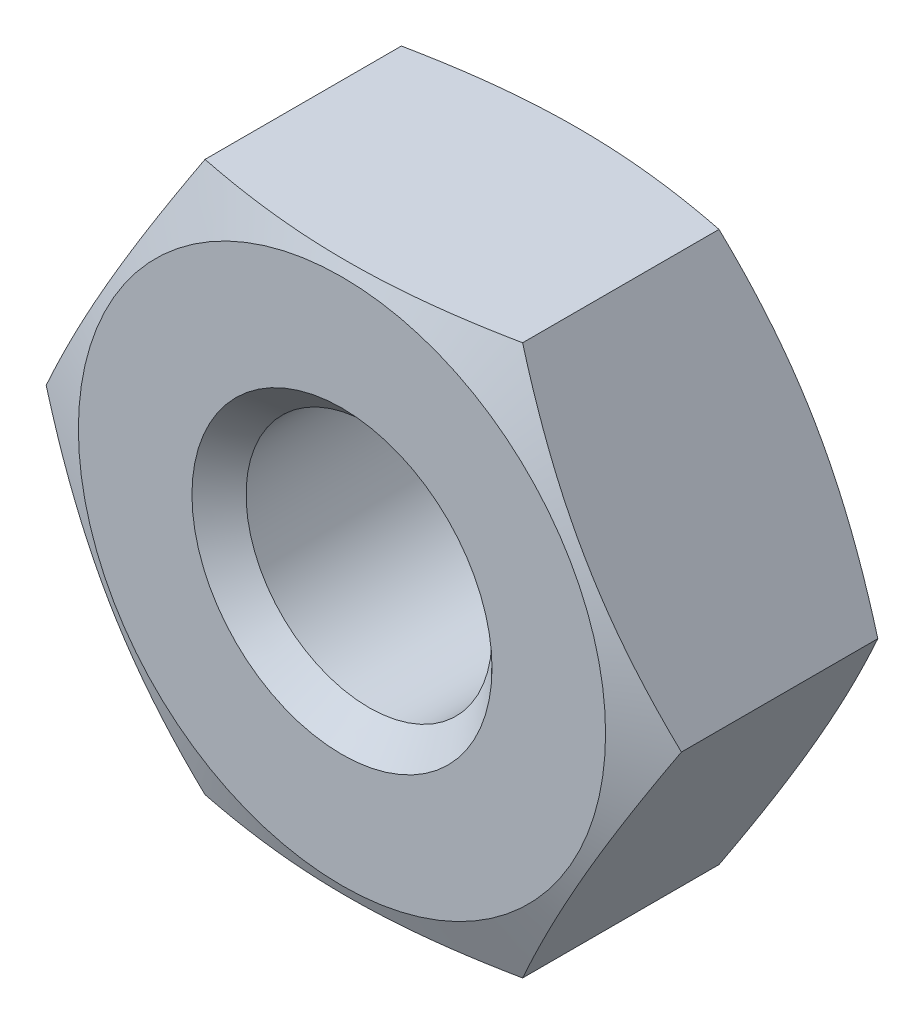
ISO-10303-21;
HEADER;
FILE_DESCRIPTION(('STEP AP214'),'2;1');
FILE_NAME('part.step','',(''),(''),'','','');
FILE_SCHEMA(('AUTOMOTIVE_DESIGN { 1 0 10303 214 1 1 1 1 }'));
ENDSEC;
DATA;
#1=APPLICATION_CONTEXT('core data for automotive mechanical design processes');
#2=APPLICATION_PROTOCOL_DEFINITION('international standard','automotive_design',2000,#1);
#3=PRODUCT_CONTEXT('',#1,'mechanical');
#4=PRODUCT('Part','Part','',(#3));
#5=PRODUCT_RELATED_PRODUCT_CATEGORY('part','',(#4));
#6=PRODUCT_DEFINITION_FORMATION('','',#4);
#7=PRODUCT_DEFINITION_CONTEXT('part definition',#1,'design');
#8=PRODUCT_DEFINITION('design','',#6,#7);
#9=PRODUCT_DEFINITION_SHAPE('','',#8);
#10=(LENGTH_UNIT() NAMED_UNIT(*) SI_UNIT(.MILLI.,.METRE.));
#11=(NAMED_UNIT(*) PLANE_ANGLE_UNIT() SI_UNIT($,.RADIAN.));
#12=(NAMED_UNIT(*) SI_UNIT($,.STERADIAN.) SOLID_ANGLE_UNIT());
#13=UNCERTAINTY_MEASURE_WITH_UNIT(LENGTH_MEASURE(1.E-05),#10,'distance_accuracy_value','');
#14=(GEOMETRIC_REPRESENTATION_CONTEXT(3) GLOBAL_UNCERTAINTY_ASSIGNED_CONTEXT((#13)) GLOBAL_UNIT_ASSIGNED_CONTEXT((#10,
#11,#12)) REPRESENTATION_CONTEXT('',''));
#15=CARTESIAN_POINT('',(0.,0.,0.));
#16=DIRECTION('',(0.,0.,1.));
#17=DIRECTION('',(1.,0.,0.));
#18=AXIS2_PLACEMENT_3D('',#15,#16,#17);
#19=CARTESIAN_POINT('',(0.,0.,0.));
#20=DIRECTION('',(0.,0.,1.));
#21=DIRECTION('',(0.,-1.,0.));
#22=AXIS2_PLACEMENT_3D('',#19,#20,#21);
#23=CONICAL_SURFACE('',#22,2.63540605016372,1.18682389135614);
#24=CARTESIAN_POINT('',(0.,0.,0.));
#25=DIRECTION('',(0.,0.,1.));
#26=DIRECTION('',(1.,0.,0.));
#27=AXIS2_PLACEMENT_3D('',#24,#25,#26);
#28=CIRCLE('',#27,2.63540605016372);
#29=CARTESIAN_POINT('',(2.63540605016372,0.,0.));
#30=VERTEX_POINT('',#29);
#31=EDGE_CURVE('E26',#30,#30,#28,.T.);
#32=ORIENTED_EDGE('',*,*,#31,.T.);
#33=EDGE_LOOP('',(#32));
#34=FACE_BOUND('',#33,.T.);
#35=CARTESIAN_POINT('',(1.58771134529946,2.7500007178122,0.218182284711373));
#36=CARTESIAN_POINT('',(1.64318176306036,2.65392313593325,0.195769469377784));
#37=CARTESIAN_POINT('',(1.69883526632536,2.55752844065907,0.175045213206388));
#38=CARTESIAN_POINT('',(1.81051027547096,2.36410165088318,0.137610782100243));
#39=CARTESIAN_POINT('',(1.86653197733575,2.26706921692688,0.120902959145267));
#40=CARTESIAN_POINT('',(1.97886364323097,2.07250506429752,0.092170328661243));
#41=CARTESIAN_POINT('',(2.03517351665932,1.97497350255184,0.0801441310734252));
#42=CARTESIAN_POINT('',(2.14800243223553,1.77954808821094,0.0613320654905071));
#43=CARTESIAN_POINT('',(2.20452142554208,1.68165432021134,0.0545450429944812));
#44=CARTESIAN_POINT('',(2.31669899030372,1.48735707857485,0.0466333860833218));
#45=CARTESIAN_POINT('',(2.3723558758764,1.39095652497191,0.0454145597877332));
#46=CARTESIAN_POINT('',(2.48363675709332,1.19821238479317,0.0484487095082309));
#47=CARTESIAN_POINT('',(2.53926074941592,1.10186880397061,0.0527021665802389));
#48=CARTESIAN_POINT('',(2.65030460516595,0.909535203943199,0.0664518250987271));
#49=CARTESIAN_POINT('',(2.70572458339085,0.813544985903308,0.0759443892350962));
#50=CARTESIAN_POINT('',(2.81630640352005,0.622011655046103,0.0997134551588299));
#51=CARTESIAN_POINT('',(2.87146824082947,0.526468550187332,0.113990041775095));
#52=CARTESIAN_POINT('',(2.94727485642289,0.395167640429688,0.136557066199637));
#53=CARTESIAN_POINT('',(2.96805776922891,0.359170579520393,0.143050874141052));
#54=CARTESIAN_POINT('',(3.00957454255017,0.287261418761646,0.156603974984698));
#55=CARTESIAN_POINT('',(3.03030840997269,0.251349306948439,0.1636631826921));
#56=CARTESIAN_POINT('',(3.0717997873129,0.17948413331918,0.178339553881967));
#57=CARTESIAN_POINT('',(3.09255713487185,0.143531352716723,0.185958546040667));
#58=CARTESIAN_POINT('',(3.13402635043607,0.0717045644094684,0.201700711556611));
#59=CARTESIAN_POINT('',(3.15473821325217,0.0358305656925843,0.209823939631184));
#60=CARTESIAN_POINT('',(3.17542615470054,-2.00000000024182E-06,0.218182284711373));
#61=B_SPLINE_CURVE_WITH_KNOTS('',3,(#35,#36,#37,#38,#39,#40,#41,#42,#43,#44,#45,#46,#47,#48,#49,
#50,#51,#52,#53,#54,#55,#56,#57,#58,#59,#60),.UNSPECIFIED.,.F.,.F.,(4,2,2,2,2,2,2,2,2,2,2,2,4),
(0.,0.339570273300476,0.679338913509567,1.01900659321178,1.35859940260041,1.69242584056802,
2.02628162645995,2.3599059201794,2.69353612994123,2.819743833718,2.94593255607843,
3.07255359531336,3.19918839897498),.UNSPECIFIED.);
#62=CARTESIAN_POINT('',(1.5877125,2.7499987178122,0.218181818181818));
#63=VERTEX_POINT('',#62);
#64=CARTESIAN_POINT('',(3.175425,0.,0.218181818181818));
#65=VERTEX_POINT('',#64);
#66=EDGE_CURVE('E183',#63,#65,#61,.T.);
#67=ORIENTED_EDGE('',*,*,#66,.T.);
#68=CARTESIAN_POINT('',(3.17542615470054,2.E-06,0.218182284711373));
#69=CARTESIAN_POINT('',(3.11995573693964,-0.096075581878954,0.195769469377785));
#70=CARTESIAN_POINT('',(3.06430223367464,-0.192470277153134,0.175045213206389));
#71=CARTESIAN_POINT('',(2.95262722452905,-0.385897066929023,0.137610782100244));
#72=CARTESIAN_POINT('',(2.89660552266425,-0.482929500885325,0.120902959145268));
#73=CARTESIAN_POINT('',(2.78427385676904,-0.677493653514685,0.0921703286612441));
#74=CARTESIAN_POINT('',(2.72796398334068,-0.775025215260366,0.0801441310734264));
#75=CARTESIAN_POINT('',(2.61513506776447,-0.970450629601267,0.0613320654905083));
#76=CARTESIAN_POINT('',(2.55861607445792,-1.06834439760086,0.0545450429944824));
#77=CARTESIAN_POINT('',(2.44643850969629,-1.26264163923736,0.0466333860833228));
#78=CARTESIAN_POINT('',(2.3907816241236,-1.3590421928403,0.0454145597877343));
#79=CARTESIAN_POINT('',(2.27950074290668,-1.55178633301904,0.048448709508232));
#80=CARTESIAN_POINT('',(2.22387675058409,-1.64812991384159,0.0527021665802398));
#81=CARTESIAN_POINT('',(2.11283289483405,-1.840463513869,0.0664518250987283));
#82=CARTESIAN_POINT('',(2.05741291660915,-1.93645373190889,0.0759443892350978));
#83=CARTESIAN_POINT('',(1.94683109647995,-2.1279870627661,0.0997134551588301));
#84=CARTESIAN_POINT('',(1.89166925917052,-2.22353016762487,0.113990041775094));
#85=CARTESIAN_POINT('',(1.81586264357711,-2.35483107738251,0.136557066199637));
#86=CARTESIAN_POINT('',(1.79507973077109,-2.39082813829181,0.143050874141053));
#87=CARTESIAN_POINT('',(1.75356295744983,-2.46273729905056,0.1566039749847));
#88=CARTESIAN_POINT('',(1.73282909002731,-2.49864941086376,0.163663182692101));
#89=CARTESIAN_POINT('',(1.6913377126871,-2.57051458449302,0.178339553881968));
#90=CARTESIAN_POINT('',(1.67058036512815,-2.60646736509548,0.185958546040668));
#91=CARTESIAN_POINT('',(1.62911114956393,-2.67829415340274,0.201700711556612));
#92=CARTESIAN_POINT('',(1.60839928674783,-2.71416815211962,0.209823939631185));
#93=CARTESIAN_POINT('',(1.58771134529946,-2.7500007178122,0.218182284711374));
#94=B_SPLINE_CURVE_WITH_KNOTS('',3,(#68,#69,#70,#71,#72,#73,#74,#75,#76,#77,#78,#79,#80,#81,#82,
#83,#84,#85,#86,#87,#88,#89,#90,#91,#92,#93),.UNSPECIFIED.,.F.,.F.,(4,2,2,2,2,2,2,2,2,2,2,2,4),
(0.,0.339570273300476,0.679338913509567,1.01900659321178,1.35859940260041,1.69242584056802,
2.02628162645995,2.3599059201794,2.69353612994123,2.819743833718,2.94593255607843,
3.07255359531336,3.19918839897498),.UNSPECIFIED.);
#95=CARTESIAN_POINT('',(1.5877125,-2.7499987178122,0.218181818181818));
#96=VERTEX_POINT('',#95);
#97=EDGE_CURVE('E33',#65,#96,#94,.T.);
#98=ORIENTED_EDGE('',*,*,#97,.T.);
#99=CARTESIAN_POINT('',(-4.20114930121897,-2.7499987178122,0.963911213647453));
#100=CARTESIAN_POINT('',(-4.0770617566197,-2.7499987178122,0.921976147347816));
#101=CARTESIAN_POINT('',(-3.95280937937804,-2.7499987178122,0.880519848328758));
#102=CARTESIAN_POINT('',(-3.7038896601783,-2.7499987178122,0.798832270413502));
#103=CARTESIAN_POINT('',(-3.57922227895096,-2.7499987178122,0.758601111323628));
#104=CARTESIAN_POINT('',(-3.32911104088897,-2.7499987178122,0.679544636225787));
#105=CARTESIAN_POINT('',(-3.20366603774239,-2.7499987178122,0.640722933673336));
#106=CARTESIAN_POINT('',(-2.9522101881305,-2.7499987178122,0.564961340510613));
#107=CARTESIAN_POINT('',(-2.8261993554436,-2.7499987178122,0.528021404345354));
#108=CARTESIAN_POINT('',(-2.57513658430622,-2.7499987178122,0.456958275898616));
#109=CARTESIAN_POINT('',(-2.45009322995417,-2.7499987178122,0.422804907509343));
#110=CARTESIAN_POINT('',(-2.19924638167065,-2.7499987178122,0.357376272749436));
#111=CARTESIAN_POINT('',(-2.07344286481096,-2.7499987178122,0.326101093657955));
#112=CARTESIAN_POINT('',(-1.82106073670608,-2.7499987178122,0.26717552338501));
#113=CARTESIAN_POINT('',(-1.69448262516452,-2.7499987178122,0.239523009883373));
#114=CARTESIAN_POINT('',(-1.44041864083928,-2.7499987178122,0.188693602611221));
#115=CARTESIAN_POINT('',(-1.31293277641552,-2.7499987178122,0.165516667678202));
#116=CARTESIAN_POINT('',(-1.08323657491687,-2.7499987178122,0.128791994056441));
#117=CARTESIAN_POINT('',(-0.981186922829808,-2.7499987178122,0.114244361009045));
#118=CARTESIAN_POINT('',(-0.776611531291951,-2.7499987178122,0.0890830286708782));
#119=CARTESIAN_POINT('',(-0.674085859073858,-2.7499987178122,0.0784687899762993));
#120=CARTESIAN_POINT('',(-0.468734002378535,-2.7499987178122,0.0615915245449646));
#121=CARTESIAN_POINT('',(-0.365908033935975,-2.7499987178122,0.0553259030172603));
#122=CARTESIAN_POINT('',(-0.160076825750848,-2.7499987178122,0.0474094888837508));
#123=CARTESIAN_POINT('',(-0.0570715874632389,-2.7499987178122,0.0457586589973342));
#124=CARTESIAN_POINT('',(0.149406151245056,-2.7499987178122,0.0471513408321865));
#125=CARTESIAN_POINT('',(0.252878496404807,-2.7499987178122,0.0502176460192745));
#126=CARTESIAN_POINT('',(0.459585326937327,-2.7499987178122,0.0609458307768399));
#127=CARTESIAN_POINT('',(0.56281980228415,-2.7499987178122,0.0686079006213009));
#128=CARTESIAN_POINT('',(0.768942924908969,-2.7499987178122,0.0882045847724907));
#129=CARTESIAN_POINT('',(0.871831314419698,-2.7499987178122,0.100141878078611));
#130=CARTESIAN_POINT('',(1.07708420563115,-2.7499987178122,0.12784009070258));
#131=CARTESIAN_POINT('',(1.17944870908963,-2.7499987178122,0.143600997182711));
#132=CARTESIAN_POINT('',(1.52098070197087,-2.74999871781221,0.201877880772112));
#133=CARTESIAN_POINT('',(1.75887575658653,-2.7499987178122,0.251857109258064));
#134=CARTESIAN_POINT('',(2.23177984086213,-2.7499987178122,0.364052250093925));
#135=CARTESIAN_POINT('',(2.46678699838615,-2.7499987178122,0.426275696876258));
#136=CARTESIAN_POINT('',(2.93514332013133,-2.7499987178122,0.558872293863703));
#137=CARTESIAN_POINT('',(3.16848635491626,-2.7499987178122,0.629266833266683));
#138=CARTESIAN_POINT('',(3.6334247091621,-2.7499987178122,0.775341816504975));
#139=CARTESIAN_POINT('',(3.86502046754398,-2.7499987178122,0.851020880300696));
#140=CARTESIAN_POINT('',(4.32543847411325,-2.7499987178122,1.00546610746214));
#141=CARTESIAN_POINT('',(4.55426889588976,-2.7499987178122,1.08420803731287));
#142=CARTESIAN_POINT('',(5.01106551664846,-2.7499987178122,1.24420580818032));
#143=CARTESIAN_POINT('',(5.23903164745715,-2.7499987178122,1.32546184305679));
#144=CARTESIAN_POINT('',(5.69278669836833,-2.7499987178122,1.48923335827728));
#145=CARTESIAN_POINT('',(5.91857998302956,-2.7499987178122,1.57173678132187));
#146=CARTESIAN_POINT('',(6.36963717330952,-2.7499987178122,1.73809022029361));
#147=CARTESIAN_POINT('',(6.59490114378208,-2.7499987178122,1.82194006020391));
#148=CARTESIAN_POINT('',(6.81998805699114,-2.7499987178122,1.90625478425654));
#149=B_SPLINE_CURVE_WITH_KNOTS('',3,(#99,#100,#101,#102,#103,#104,#105,#106,#107,#108,#109,#110,
#111,#112,#113,#114,#115,#116,#117,#118,#119,#120,#121,#122,#123,#124,#125,#126,#127,#128,#129,
#130,#131,#132,#133,#134,#135,#136,#137,#138,#139,#140,#141,#142,#143,#144,#145,#146,#147,#148),
.UNSPECIFIED.,.F.,.F.,(4,2,2,2,2,2,2,2,2,2,2,2,2,2,2,2,2,2,2,2,2,2,2,2,4),(0.,0.392949148644194,
0.785936601152513,1.17986911596664,1.57379208967773,1.96263614388314,2.35149198564005,
2.74011898962569,3.12874241918576,3.43792072457201,3.74705661526247,4.05600788766811,
4.36495666420252,4.67540299471667,4.98586217922621,5.29651624931791,5.60716927640827,
6.33585792378878,7.06499637705659,7.79608844621957,8.52699030153565,9.25296791679587,
9.97900165155214,10.7001797967706,11.4212644179041),.UNSPECIFIED.);
#150=CARTESIAN_POINT('',(-1.5877125,-2.7499987178122,0.218181818181819));
#151=VERTEX_POINT('',#150);
#152=EDGE_CURVE('E76',#96,#151,#149,.F.);
#153=ORIENTED_EDGE('',*,*,#152,.T.);
#154=CARTESIAN_POINT('',(-1.58771134529947,-2.7500007178122,0.218182284711373));
#155=CARTESIAN_POINT('',(-1.64318176306037,-2.65392313593325,0.195769469377784));
#156=CARTESIAN_POINT('',(-1.69883526632536,-2.55752844065907,0.175045213206388));
#157=CARTESIAN_POINT('',(-1.81051027547096,-2.36410165088318,0.137610782100242));
#158=CARTESIAN_POINT('',(-1.86653197733575,-2.26706921692687,0.120902959145266));
#159=CARTESIAN_POINT('',(-1.97886364323097,-2.07250506429752,0.092170328661243));
#160=CARTESIAN_POINT('',(-2.03517351665932,-1.97497350255183,0.0801441310734254));
#161=CARTESIAN_POINT('',(-2.14800243223553,-1.77954808821093,0.0613320654905073));
#162=CARTESIAN_POINT('',(-2.20452142554208,-1.68165432021134,0.0545450429944814));
#163=CARTESIAN_POINT('',(-2.31669899030372,-1.48735707857485,0.0466333860833219));
#164=CARTESIAN_POINT('',(-2.3723558758764,-1.39095652497191,0.0454145597877334));
#165=CARTESIAN_POINT('',(-2.48363675709332,-1.19821238479317,0.0484487095082312));
#166=CARTESIAN_POINT('',(-2.53926074941592,-1.10186880397061,0.052702166580239));
#167=CARTESIAN_POINT('',(-2.65030460516595,-0.909535203943198,0.0664518250987272));
#168=CARTESIAN_POINT('',(-2.70572458339085,-0.813544985903307,0.0759443892350963));
#169=CARTESIAN_POINT('',(-2.81630640352005,-0.622011655046102,0.0997134551588301));
#170=CARTESIAN_POINT('',(-2.87146824082948,-0.526468550187332,0.113990041775096));
#171=CARTESIAN_POINT('',(-2.94727485642289,-0.395167640429688,0.136557066199638));
#172=CARTESIAN_POINT('',(-2.96805776922891,-0.359170579520393,0.143050874141053));
#173=CARTESIAN_POINT('',(-3.00957454255017,-0.287261418761645,0.156603974984699));
#174=CARTESIAN_POINT('',(-3.03030840997269,-0.251349306948438,0.1636631826921));
#175=CARTESIAN_POINT('',(-3.0717997873129,-0.17948413331918,0.178339553881967));
#176=CARTESIAN_POINT('',(-3.09255713487185,-0.143531352716723,0.185958546040667));
#177=CARTESIAN_POINT('',(-3.13402635043607,-0.071704564409468,0.201700711556611));
#178=CARTESIAN_POINT('',(-3.15473821325217,-0.0358305656925838,0.209823939631184));
#179=CARTESIAN_POINT('',(-3.17542615470054,2.00000000058543E-06,0.218182284711373));
#180=B_SPLINE_CURVE_WITH_KNOTS('',3,(#154,#155,#156,#157,#158,#159,#160,#161,#162,#163,#164,
#165,#166,#167,#168,#169,#170,#171,#172,#173,#174,#175,#176,#177,#178,#179),.UNSPECIFIED.,.F.,
.F.,(4,2,2,2,2,2,2,2,2,2,2,2,4),(0.,0.339570273300476,0.679338913509566,1.01900659321178,
1.35859940260041,1.69242584056802,2.02628162645995,2.35990592017939,2.69353612994122,
2.819743833718,2.94593255607843,3.07255359531336,3.19918839897498),.UNSPECIFIED.);
#181=CARTESIAN_POINT('',(-3.175425,0.,0.218181818181818));
#182=VERTEX_POINT('',#181);
#183=EDGE_CURVE('E87',#151,#182,#180,.T.);
#184=ORIENTED_EDGE('',*,*,#183,.T.);
#185=CARTESIAN_POINT('',(-3.17542615470054,-1.99999999944489E-06,0.218182284711373));
#186=CARTESIAN_POINT('',(-3.11995573693964,0.096075581878953,0.195769469377784));
#187=CARTESIAN_POINT('',(-3.06430223367464,0.192470277153133,0.175045213206387));
#188=CARTESIAN_POINT('',(-2.95262722452904,0.385897066929021,0.137610782100242));
#189=CARTESIAN_POINT('',(-2.89660552266425,0.482929500885323,0.120902959145266));
#190=CARTESIAN_POINT('',(-2.78427385676903,0.677493653514683,0.0921703286612427));
#191=CARTESIAN_POINT('',(-2.72796398334068,0.775025215260364,0.080144131073425));
#192=CARTESIAN_POINT('',(-2.61513506776447,0.970450629601265,0.0613320654905068));
#193=CARTESIAN_POINT('',(-2.55861607445792,1.06834439760086,0.054545042994481));
#194=CARTESIAN_POINT('',(-2.44643850969628,1.26264163923735,0.0466333860833215));
#195=CARTESIAN_POINT('',(-2.3907816241236,1.35904219284029,0.0454145597877329));
#196=CARTESIAN_POINT('',(-2.27950074290668,1.55178633301903,0.0484487095082306));
#197=CARTESIAN_POINT('',(-2.22387675058408,1.64812991384159,0.0527021665802386));
#198=CARTESIAN_POINT('',(-2.11283289483405,1.840463513869,0.0664518250987269));
#199=CARTESIAN_POINT('',(-2.05741291660914,1.93645373190889,0.075944389235096));
#200=CARTESIAN_POINT('',(-1.94683109647995,2.1279870627661,0.0997134551588295));
#201=CARTESIAN_POINT('',(-1.89166925917053,2.22353016762487,0.113990041775095));
#202=CARTESIAN_POINT('',(-1.81586264357711,2.35483107738251,0.136557066199637));
#203=CARTESIAN_POINT('',(-1.79507973077109,2.39082813829181,0.143050874141052));
#204=CARTESIAN_POINT('',(-1.75356295744983,2.46273729905056,0.156603974984699));
#205=CARTESIAN_POINT('',(-1.73282909002731,2.49864941086376,0.1636631826921));
#206=CARTESIAN_POINT('',(-1.69133771268709,2.57051458449302,0.178339553881967));
#207=CARTESIAN_POINT('',(-1.67058036512815,2.60646736509548,0.185958546040667));
#208=CARTESIAN_POINT('',(-1.62911114956393,2.67829415340273,0.201700711556611));
#209=CARTESIAN_POINT('',(-1.60839928674783,2.71416815211962,0.209823939631184));
#210=CARTESIAN_POINT('',(-1.58771134529946,2.7500007178122,0.218182284711373));
#211=B_SPLINE_CURVE_WITH_KNOTS('',3,(#185,#186,#187,#188,#189,#190,#191,#192,#193,#194,#195,
#196,#197,#198,#199,#200,#201,#202,#203,#204,#205,#206,#207,#208,#209,#210),.UNSPECIFIED.,.F.,
.F.,(4,2,2,2,2,2,2,2,2,2,2,2,4),(0.,0.339570273300476,0.679338913509567,1.01900659321178,
1.35859940260041,1.69242584056802,2.02628162645995,2.3599059201794,2.69353612994123,
2.819743833718,2.94593255607843,3.07255359531336,3.19918839897498),.UNSPECIFIED.);
#212=CARTESIAN_POINT('',(-1.5877125,2.7499987178122,0.218181818181818));
#213=VERTEX_POINT('',#212);
#214=EDGE_CURVE('E93',#182,#213,#211,.T.);
#215=ORIENTED_EDGE('',*,*,#214,.T.);
#216=CARTESIAN_POINT('',(-4.20114930121897,2.7499987178122,0.963911213647452));
#217=CARTESIAN_POINT('',(-4.0770617566197,2.7499987178122,0.921976147347816));
#218=CARTESIAN_POINT('',(-3.95280937937804,2.7499987178122,0.880519848328758));
#219=CARTESIAN_POINT('',(-3.7038896601783,2.7499987178122,0.798832270413502));
#220=CARTESIAN_POINT('',(-3.57922227895096,2.7499987178122,0.758601111323628));
#221=CARTESIAN_POINT('',(-3.32911104088897,2.7499987178122,0.679544636225787));
#222=CARTESIAN_POINT('',(-3.20366603774239,2.7499987178122,0.640722933673337));
#223=CARTESIAN_POINT('',(-2.9522101881305,2.7499987178122,0.564961340510613));
#224=CARTESIAN_POINT('',(-2.8261993554436,2.7499987178122,0.528021404345354));
#225=CARTESIAN_POINT('',(-2.57513658430622,2.7499987178122,0.456958275898615));
#226=CARTESIAN_POINT('',(-2.45009322995417,2.7499987178122,0.422804907509343));
#227=CARTESIAN_POINT('',(-2.19924638167065,2.7499987178122,0.357376272749436));
#228=CARTESIAN_POINT('',(-2.07344286481096,2.7499987178122,0.326101093657955));
#229=CARTESIAN_POINT('',(-1.82106073670608,2.7499987178122,0.26717552338501));
#230=CARTESIAN_POINT('',(-1.69448262516451,2.7499987178122,0.239523009883372));
#231=CARTESIAN_POINT('',(-1.44041864083928,2.7499987178122,0.18869360261122));
#232=CARTESIAN_POINT('',(-1.31293277641552,2.7499987178122,0.165516667678202));
#233=CARTESIAN_POINT('',(-1.08323657491687,2.7499987178122,0.128791994056441));
#234=CARTESIAN_POINT('',(-0.981186922829807,2.7499987178122,0.114244361009044));
#235=CARTESIAN_POINT('',(-0.776611531291949,2.7499987178122,0.0890830286708775));
#236=CARTESIAN_POINT('',(-0.674085859073856,2.7499987178122,0.0784687899762988));
#237=CARTESIAN_POINT('',(-0.468734002378532,2.7499987178122,0.0615915245449642));
#238=CARTESIAN_POINT('',(-0.365908033935973,2.7499987178122,0.0553259030172596));
#239=CARTESIAN_POINT('',(-0.160076825750845,2.7499987178122,0.04740948888375));
#240=CARTESIAN_POINT('',(-0.057071587463236,2.7499987178122,0.0457586589973333));
#241=CARTESIAN_POINT('',(0.149406151245059,2.7499987178122,0.0471513408321857));
#242=CARTESIAN_POINT('',(0.252878496404809,2.7499987178122,0.0502176460192736));
#243=CARTESIAN_POINT('',(0.459585326937329,2.7499987178122,0.0609458307768391));
#244=CARTESIAN_POINT('',(0.562819802284152,2.7499987178122,0.0686079006213003));
#245=CARTESIAN_POINT('',(0.768942924908971,2.7499987178122,0.0882045847724901));
#246=CARTESIAN_POINT('',(0.8718313144197,2.7499987178122,0.100141878078611));
#247=CARTESIAN_POINT('',(1.07708420563115,2.7499987178122,0.127840090702579));
#248=CARTESIAN_POINT('',(1.17944870908963,2.7499987178122,0.143600997182711));
#249=CARTESIAN_POINT('',(1.52098070197087,2.7499987178122,0.201877880772111));
#250=CARTESIAN_POINT('',(1.75887575658653,2.7499987178122,0.251857109258064));
#251=CARTESIAN_POINT('',(2.23177984086213,2.7499987178122,0.364052250093924));
#252=CARTESIAN_POINT('',(2.46678699838615,2.7499987178122,0.426275696876257));
#253=CARTESIAN_POINT('',(2.93514332013133,2.7499987178122,0.558872293863702));
#254=CARTESIAN_POINT('',(3.16848635491626,2.7499987178122,0.629266833266682));
#255=CARTESIAN_POINT('',(3.6334247091621,2.7499987178122,0.775341816504974));
#256=CARTESIAN_POINT('',(3.86502046754398,2.7499987178122,0.851020880300695));
#257=CARTESIAN_POINT('',(4.32543847411325,2.7499987178122,1.00546610746214));
#258=CARTESIAN_POINT('',(4.55426889588975,2.7499987178122,1.08420803731287));
#259=CARTESIAN_POINT('',(5.01106551664846,2.7499987178122,1.24420580818032));
#260=CARTESIAN_POINT('',(5.23903164745715,2.7499987178122,1.32546184305679));
#261=CARTESIAN_POINT('',(5.69278669836833,2.7499987178122,1.48923335827728));
#262=CARTESIAN_POINT('',(5.91857998302956,2.7499987178122,1.57173678132187));
#263=CARTESIAN_POINT('',(6.36963717330952,2.7499987178122,1.73809022029361));
#264=CARTESIAN_POINT('',(6.59490114378208,2.7499987178122,1.82194006020391));
#265=CARTESIAN_POINT('',(6.81998805699114,2.7499987178122,1.90625478425654));
#266=B_SPLINE_CURVE_WITH_KNOTS('',3,(#216,#217,#218,#219,#220,#221,#222,#223,#224,#225,#226,
#227,#228,#229,#230,#231,#232,#233,#234,#235,#236,#237,#238,#239,#240,#241,#242,#243,#244,#245,
#246,#247,#248,#249,#250,#251,#252,#253,#254,#255,#256,#257,#258,#259,#260,#261,#262,#263,#264,
#265),.UNSPECIFIED.,.F.,.F.,(4,2,2,2,2,2,2,2,2,2,2,2,2,2,2,2,2,2,2,2,2,2,2,2,4),(0.,
0.392949148644194,0.785936601152513,1.17986911596664,1.57379208967773,1.96263614388314,
2.35149198564005,2.7401189896257,3.12874241918576,3.43792072457201,3.74705661526247,
4.05600788766811,4.36495666420253,4.67540299471667,4.98586217922621,5.29651624931791,
5.60716927640828,6.33585792378878,7.06499637705659,7.79608844621957,8.52699030153565,
9.25296791679586,9.97900165155214,10.7001797967706,11.4212644179041),.UNSPECIFIED.);
#267=EDGE_CURVE('E189',#213,#63,#266,.T.);
#268=ORIENTED_EDGE('',*,*,#267,.T.);
#269=EDGE_LOOP('',(#67,#98,#153,#184,#215,#268));
#270=FACE_BOUND('',#269,.T.);
#271=ADVANCED_FACE('F16',(#34,#270),#23,.T.);
#272=CARTESIAN_POINT('',(3.175425,0.,0.));
#273=DIRECTION('',(0.,0.,1.));
#274=DIRECTION('',(1.,0.,0.));
#275=AXIS2_PLACEMENT_3D('',#272,#273,#274);
#276=PLANE('',#275);
#277=CARTESIAN_POINT('',(0.,0.,0.));
#278=DIRECTION('',(0.,0.,1.));
#279=DIRECTION('',(1.,0.,0.));
#280=AXIS2_PLACEMENT_3D('',#277,#278,#279);
#281=CIRCLE('',#280,1.5);
#282=CARTESIAN_POINT('',(1.5,0.,0.));
#283=VERTEX_POINT('',#282);
#284=EDGE_CURVE('E11',#283,#283,#281,.F.);
#285=ORIENTED_EDGE('',*,*,#284,.F.);
#286=EDGE_LOOP('',(#285));
#287=FACE_BOUND('',#286,.T.);
#288=ORIENTED_EDGE('',*,*,#31,.F.);
#289=EDGE_LOOP('',(#288));
#290=FACE_BOUND('',#289,.T.);
#291=ADVANCED_FACE('F211',(#287,#290),#276,.F.);
#292=CARTESIAN_POINT('',(0.,0.,2.4));
#293=DIRECTION('',(0.,0.,1.));
#294=DIRECTION('',(0.,-1.,0.));
#295=AXIS2_PLACEMENT_3D('',#292,#293,#294);
#296=CONICAL_SURFACE('',#295,1.5,0.785398163397449);
#297=CARTESIAN_POINT('',(0.,0.,2.129375));
#298=DIRECTION('',(0.,0.,-1.));
#299=DIRECTION('',(0.,1.,0.));
#300=AXIS2_PLACEMENT_3D('',#297,#298,#299);
#301=CIRCLE('',#300,1.229375);
#302=CARTESIAN_POINT('',(0.,1.229375,2.129375));
#303=VERTEX_POINT('',#302);
#304=EDGE_CURVE('E353',#303,#303,#301,.T.);
#305=ORIENTED_EDGE('',*,*,#304,.T.);
#306=EDGE_LOOP('',(#305));
#307=FACE_BOUND('',#306,.T.);
#308=CARTESIAN_POINT('',(0.,0.,2.4));
#309=DIRECTION('',(0.,0.,-1.));
#310=DIRECTION('',(0.,1.,0.));
#311=AXIS2_PLACEMENT_3D('',#308,#309,#310);
#312=CIRCLE('',#311,1.5);
#313=CARTESIAN_POINT('',(0.,1.5,2.4));
#314=VERTEX_POINT('',#313);
#315=EDGE_CURVE('E104',#314,#314,#312,.T.);
#316=ORIENTED_EDGE('',*,*,#315,.F.);
#317=EDGE_LOOP('',(#316));
#318=FACE_BOUND('',#317,.T.);
#319=ADVANCED_FACE('F149',(#307,#318),#296,.F.);
#320=CARTESIAN_POINT('',(0.,0.,0.));
#321=DIRECTION('',(0.,0.,-1.));
#322=DIRECTION('',(0.,1.,0.));
#323=AXIS2_PLACEMENT_3D('',#320,#321,#322);
#324=CYLINDRICAL_SURFACE('',#323,1.229375);
#325=CARTESIAN_POINT('',(0.,0.,0.270625));
#326=DIRECTION('',(0.,0.,-1.));
#327=DIRECTION('',(0.,1.,0.));
#328=AXIS2_PLACEMENT_3D('',#325,#326,#327);
#329=CIRCLE('',#328,1.229375);
#330=CARTESIAN_POINT('',(0.,1.229375,0.270625));
#331=VERTEX_POINT('',#330);
#332=EDGE_CURVE('E357',#331,#331,#329,.T.);
#333=ORIENTED_EDGE('',*,*,#332,.T.);
#334=EDGE_LOOP('',(#333));
#335=FACE_BOUND('',#334,.T.);
#336=ORIENTED_EDGE('',*,*,#304,.F.);
#337=EDGE_LOOP('',(#336));
#338=FACE_BOUND('',#337,.T.);
#339=ADVANCED_FACE('F319',(#335,#338),#324,.F.);
#340=CARTESIAN_POINT('',(0.,0.,0.270625));
#341=DIRECTION('',(0.,0.,-1.));
#342=DIRECTION('',(0.,1.,0.));
#343=AXIS2_PLACEMENT_3D('',#340,#341,#342);
#344=CONICAL_SURFACE('',#343,1.229375,0.785398163397449);
#345=ORIENTED_EDGE('',*,*,#284,.T.);
#346=EDGE_LOOP('',(#345));
#347=FACE_BOUND('',#346,.T.);
#348=ORIENTED_EDGE('',*,*,#332,.F.);
#349=EDGE_LOOP('',(#348));
#350=FACE_BOUND('',#349,.T.);
#351=ADVANCED_FACE('F310',(#347,#350),#344,.F.);
#352=CARTESIAN_POINT('',(3.175425,0.,2.4));
#353=DIRECTION('',(0.,0.,1.));
#354=DIRECTION('',(1.,0.,0.));
#355=AXIS2_PLACEMENT_3D('',#352,#353,#354);
#356=PLANE('',#355);
#357=CARTESIAN_POINT('',(0.,0.,2.4));
#358=DIRECTION('',(0.,0.,-1.));
#359=DIRECTION('',(0.,1.,0.));
#360=AXIS2_PLACEMENT_3D('',#357,#358,#359);
#361=CIRCLE('',#360,2.63540605016372);
#362=CARTESIAN_POINT('',(0.,2.63540605016372,2.4));
#363=VERTEX_POINT('',#362);
#364=EDGE_CURVE('E97',#363,#363,#361,.T.);
#365=ORIENTED_EDGE('',*,*,#364,.F.);
#366=EDGE_LOOP('',(#365));
#367=FACE_BOUND('',#366,.T.);
#368=ORIENTED_EDGE('',*,*,#315,.T.);
#369=EDGE_LOOP('',(#368));
#370=FACE_BOUND('',#369,.T.);
#371=ADVANCED_FACE('F123',(#367,#370),#356,.T.);
#372=CARTESIAN_POINT('',(0.,0.,2.18181818181818));
#373=DIRECTION('',(0.,0.,-1.));
#374=DIRECTION('',(0.,1.,0.));
#375=AXIS2_PLACEMENT_3D('',#372,#373,#374);
#376=CONICAL_SURFACE('',#375,3.175425,1.18682389135614);
#377=ORIENTED_EDGE('',*,*,#364,.T.);
#378=EDGE_LOOP('',(#377));
#379=FACE_BOUND('',#378,.T.);
#380=CARTESIAN_POINT('',(-4.20114930121897,-2.7499987178122,1.43608878635255));
#381=CARTESIAN_POINT('',(-4.0770617566197,-2.7499987178122,1.47802385265218));
#382=CARTESIAN_POINT('',(-3.95280937937804,-2.7499987178122,1.51948015167124));
#383=CARTESIAN_POINT('',(-3.7038896601783,-2.7499987178122,1.6011677295865));
#384=CARTESIAN_POINT('',(-3.57922227895095,-2.7499987178122,1.64139888867637));
#385=CARTESIAN_POINT('',(-3.32911104088897,-2.7499987178122,1.72045536377421));
#386=CARTESIAN_POINT('',(-3.20366603774239,-2.7499987178122,1.75927706632666));
#387=CARTESIAN_POINT('',(-2.9522101881305,-2.7499987178122,1.83503865948939));
#388=CARTESIAN_POINT('',(-2.8261993554436,-2.7499987178122,1.87197859565464));
#389=CARTESIAN_POINT('',(-2.57513658430622,-2.7499987178122,1.94304172410138));
#390=CARTESIAN_POINT('',(-2.45009322995417,-2.7499987178122,1.97719509249066));
#391=CARTESIAN_POINT('',(-2.19924638167065,-2.7499987178122,2.04262372725056));
#392=CARTESIAN_POINT('',(-2.07344286481096,-2.7499987178122,2.07389890634204));
#393=CARTESIAN_POINT('',(-1.82106073670608,-2.7499987178122,2.13282447661499));
#394=CARTESIAN_POINT('',(-1.69448262516452,-2.7499987178122,2.16047699011663));
#395=CARTESIAN_POINT('',(-1.44041864083928,-2.7499987178122,2.21130639738878));
#396=CARTESIAN_POINT('',(-1.31293277641552,-2.7499987178122,2.2344833323218));
#397=CARTESIAN_POINT('',(-1.08323657491687,-2.7499987178122,2.27120800594356));
#398=CARTESIAN_POINT('',(-0.981186922829809,-2.7499987178122,2.28575563899095));
#399=CARTESIAN_POINT('',(-0.776611531291952,-2.7499987178122,2.31091697132912));
#400=CARTESIAN_POINT('',(-0.674085859073858,-2.7499987178122,2.3215312100237));
#401=CARTESIAN_POINT('',(-0.468734002378535,-2.7499987178122,2.33840847545503));
#402=CARTESIAN_POINT('',(-0.365908033935976,-2.7499987178122,2.34467409698274));
#403=CARTESIAN_POINT('',(-0.160076825750849,-2.7499987178122,2.35259051111625));
#404=CARTESIAN_POINT('',(-0.0570715874632396,-2.7499987178122,2.35424134100266));
#405=CARTESIAN_POINT('',(0.149406151245056,-2.7499987178122,2.35284865916781));
#406=CARTESIAN_POINT('',(0.252878496404806,-2.7499987178122,2.34978235398073));
#407=CARTESIAN_POINT('',(0.459585326937326,-2.7499987178122,2.33905416922316));
#408=CARTESIAN_POINT('',(0.562819802284149,-2.7499987178122,2.3313920993787));
#409=CARTESIAN_POINT('',(0.768942924908969,-2.7499987178122,2.31179541522751));
#410=CARTESIAN_POINT('',(0.871831314419697,-2.7499987178122,2.29985812192139));
#411=CARTESIAN_POINT('',(1.07708420563115,-2.7499987178122,2.27215990929742));
#412=CARTESIAN_POINT('',(1.17944870908963,-2.7499987178122,2.25639900281729));
#413=CARTESIAN_POINT('',(1.52098070197087,-2.74999871781221,2.19812211922789));
#414=CARTESIAN_POINT('',(1.75887575658653,-2.7499987178122,2.14814289074194));
#415=CARTESIAN_POINT('',(2.23177984086213,-2.7499987178122,2.03594774990607));
#416=CARTESIAN_POINT('',(2.46678699838615,-2.7499987178122,1.97372430312374));
#417=CARTESIAN_POINT('',(2.93514332013133,-2.7499987178122,1.8411277061363));
#418=CARTESIAN_POINT('',(3.16848635491626,-2.7499987178122,1.77073316673332));
#419=CARTESIAN_POINT('',(3.6334247091621,-2.7499987178122,1.62465818349502));
#420=CARTESIAN_POINT('',(3.86502046754398,-2.7499987178122,1.5489791196993));
#421=CARTESIAN_POINT('',(4.32543847411325,-2.7499987178122,1.39453389253785));
#422=CARTESIAN_POINT('',(4.55426889588975,-2.7499987178122,1.31579196268713));
#423=CARTESIAN_POINT('',(5.01106551664846,-2.7499987178122,1.15579419181968));
#424=CARTESIAN_POINT('',(5.23903164745715,-2.7499987178122,1.07453815694321));
#425=CARTESIAN_POINT('',(5.69278669836833,-2.7499987178122,0.910766641722718));
#426=CARTESIAN_POINT('',(5.91857998302956,-2.7499987178122,0.828263218678129));
#427=CARTESIAN_POINT('',(6.36963717330952,-2.7499987178122,0.661909779706389));
#428=CARTESIAN_POINT('',(6.59490114378208,-2.7499987178122,0.578059939796086));
#429=CARTESIAN_POINT('',(6.81998805699114,-2.7499987178122,0.493745215743456));
#430=B_SPLINE_CURVE_WITH_KNOTS('',3,(#380,#381,#382,#383,#384,#385,#386,#387,#388,#389,#390,
#391,#392,#393,#394,#395,#396,#397,#398,#399,#400,#401,#402,#403,#404,#405,#406,#407,#408,#409,
#410,#411,#412,#413,#414,#415,#416,#417,#418,#419,#420,#421,#422,#423,#424,#425,#426,#427,#428,
#429),.UNSPECIFIED.,.F.,.F.,(4,2,2,2,2,2,2,2,2,2,2,2,2,2,2,2,2,2,2,2,2,2,2,2,4),(0.,
0.392949148644194,0.785936601152513,1.17986911596664,1.57379208967773,1.96263614388313,
2.35149198564005,2.74011898962569,3.12874241918576,3.43792072457201,3.74705661526247,
4.05600788766811,4.36495666420252,4.67540299471667,4.9858621792262,5.29651624931791,
5.60716927640827,6.33585792378878,7.06499637705659,7.79608844621957,8.52699030153565,
9.25296791679586,9.97900165155214,10.7001797967706,11.4212644179041),.UNSPECIFIED.);
#431=CARTESIAN_POINT('',(-1.5877125,-2.7499987178122,2.18181818181818));
#432=VERTEX_POINT('',#431);
#433=CARTESIAN_POINT('',(1.5877125,-2.7499987178122,2.18181818181818));
#434=VERTEX_POINT('',#433);
#435=EDGE_CURVE('E78',#432,#434,#430,.T.);
#436=ORIENTED_EDGE('',*,*,#435,.T.);
#437=CARTESIAN_POINT('',(1.58771134529946,-2.7500007178122,2.18181771528863));
#438=CARTESIAN_POINT('',(1.64318176306036,-2.65392313593325,2.20423053062221));
#439=CARTESIAN_POINT('',(1.69883526632536,-2.55752844065907,2.22495478679361));
#440=CARTESIAN_POINT('',(1.81051027547096,-2.36410165088318,2.26238921789976));
#441=CARTESIAN_POINT('',(1.86653197733575,-2.26706921692688,2.27909704085473));
#442=CARTESIAN_POINT('',(1.97886364323097,-2.07250506429752,2.30782967133876));
#443=CARTESIAN_POINT('',(2.03517351665932,-1.97497350255184,2.31985586892657));
#444=CARTESIAN_POINT('',(2.14800243223553,-1.77954808821094,2.33866793450949));
#445=CARTESIAN_POINT('',(2.20452142554208,-1.68165432021135,2.34545495700552));
#446=CARTESIAN_POINT('',(2.31669899030372,-1.48735707857485,2.35336661391668));
#447=CARTESIAN_POINT('',(2.3723558758764,-1.39095652497191,2.35458544021227));
#448=CARTESIAN_POINT('',(2.48363675709332,-1.19821238479317,2.35155129049177));
#449=CARTESIAN_POINT('',(2.53926074941592,-1.10186880397062,2.34729783341976));
#450=CARTESIAN_POINT('',(2.65030460516595,-0.909535203943204,2.33354817490127));
#451=CARTESIAN_POINT('',(2.70572458339086,-0.813544985903314,2.3240556107649));
#452=CARTESIAN_POINT('',(2.81630640352005,-0.622011655046107,2.30028654484117));
#453=CARTESIAN_POINT('',(2.87146824082947,-0.526468550187333,2.28600995822491));
#454=CARTESIAN_POINT('',(2.94727485642289,-0.395167640429692,2.26344293380036));
#455=CARTESIAN_POINT('',(2.96805776922891,-0.359170579520398,2.25694912585895));
#456=CARTESIAN_POINT('',(3.00957454255017,-0.287261418761651,2.2433960250153));
#457=CARTESIAN_POINT('',(3.03030840997269,-0.251349306948443,2.2363368173079));
#458=CARTESIAN_POINT('',(3.07179978731291,-0.179484133319184,2.22166044611803));
#459=CARTESIAN_POINT('',(3.09255713487185,-0.143531352716726,2.21404145395933));
#460=CARTESIAN_POINT('',(3.13402635043607,-0.0717045644094709,2.19829928844339));
#461=CARTESIAN_POINT('',(3.15473821325217,-0.0358305656925861,2.19017606036881));
#462=CARTESIAN_POINT('',(3.17542615470054,1.99999999974139E-06,2.18181771528863));
#463=B_SPLINE_CURVE_WITH_KNOTS('',3,(#437,#438,#439,#440,#441,#442,#443,#444,#445,#446,#447,
#448,#449,#450,#451,#452,#453,#454,#455,#456,#457,#458,#459,#460,#461,#462),.UNSPECIFIED.,.F.,
.F.,(4,2,2,2,2,2,2,2,2,2,2,2,4),(0.,0.339570273300476,0.679338913509567,1.01900659321178,
1.35859940260041,1.69242584056802,2.02628162645995,2.35990592017939,2.69353612994123,
2.819743833718,2.94593255607843,3.07255359531336,3.19918839897498),.UNSPECIFIED.);
#464=CARTESIAN_POINT('',(3.175425,0.,2.18181818181818));
#465=VERTEX_POINT('',#464);
#466=EDGE_CURVE('E172',#434,#465,#463,.T.);
#467=ORIENTED_EDGE('',*,*,#466,.T.);
#468=CARTESIAN_POINT('',(3.17542615470054,-2.00000000003908E-06,2.18181771528863));
#469=CARTESIAN_POINT('',(3.11995573693964,0.0960755818789529,2.20423053062221));
#470=CARTESIAN_POINT('',(3.06430223367464,0.192470277153133,2.22495478679361));
#471=CARTESIAN_POINT('',(2.95262722452904,0.385897066929021,2.26238921789976));
#472=CARTESIAN_POINT('',(2.89660552266425,0.482929500885323,2.27909704085473));
#473=CARTESIAN_POINT('',(2.78427385676904,0.677493653514683,2.30782967133876));
#474=CARTESIAN_POINT('',(2.72796398334068,0.775025215260364,2.31985586892657));
#475=CARTESIAN_POINT('',(2.61513506776447,0.970450629601265,2.33866793450949));
#476=CARTESIAN_POINT('',(2.55861607445792,1.06834439760086,2.34545495700552));
#477=CARTESIAN_POINT('',(2.44643850969628,1.26264163923735,2.35336661391668));
#478=CARTESIAN_POINT('',(2.3907816241236,1.35904219284029,2.35458544021227));
#479=CARTESIAN_POINT('',(2.27950074290668,1.55178633301903,2.35155129049177));
#480=CARTESIAN_POINT('',(2.22387675058409,1.64812991384159,2.34729783341976));
#481=CARTESIAN_POINT('',(2.11283289483405,1.840463513869,2.33354817490127));
#482=CARTESIAN_POINT('',(2.05741291660915,1.93645373190889,2.3240556107649));
#483=CARTESIAN_POINT('',(1.94683109647995,2.1279870627661,2.30028654484117));
#484=CARTESIAN_POINT('',(1.89166925917053,2.22353016762487,2.28600995822491));
#485=CARTESIAN_POINT('',(1.81586264357711,2.35483107738251,2.26344293380036));
#486=CARTESIAN_POINT('',(1.79507973077109,2.39082813829181,2.25694912585895));
#487=CARTESIAN_POINT('',(1.75356295744983,2.46273729905055,2.2433960250153));
#488=CARTESIAN_POINT('',(1.73282909002731,2.49864941086376,2.2363368173079));
#489=CARTESIAN_POINT('',(1.6913377126871,2.57051458449302,2.22166044611803));
#490=CARTESIAN_POINT('',(1.67058036512815,2.60646736509548,2.21404145395933));
#491=CARTESIAN_POINT('',(1.62911114956393,2.67829415340273,2.19829928844339));
#492=CARTESIAN_POINT('',(1.60839928674783,2.71416815211962,2.19017606036881));
#493=CARTESIAN_POINT('',(1.58771134529946,2.7500007178122,2.18181771528863));
#494=B_SPLINE_CURVE_WITH_KNOTS('',3,(#468,#469,#470,#471,#472,#473,#474,#475,#476,#477,#478,
#479,#480,#481,#482,#483,#484,#485,#486,#487,#488,#489,#490,#491,#492,#493),.UNSPECIFIED.,.F.,
.F.,(4,2,2,2,2,2,2,2,2,2,2,2,4),(0.,0.339570273300476,0.679338913509567,1.01900659321178,
1.35859940260041,1.69242584056802,2.02628162645995,2.35990592017939,2.69353612994122,
2.819743833718,2.94593255607843,3.07255359531336,3.19918839897498),.UNSPECIFIED.);
#495=CARTESIAN_POINT('',(1.5877125,2.7499987178122,2.18181818181818));
#496=VERTEX_POINT('',#495);
#497=EDGE_CURVE('E40',#465,#496,#494,.T.);
#498=ORIENTED_EDGE('',*,*,#497,.T.);
#499=CARTESIAN_POINT('',(-4.20114930121897,2.7499987178122,1.43608878635255));
#500=CARTESIAN_POINT('',(-4.0770617566197,2.7499987178122,1.47802385265218));
#501=CARTESIAN_POINT('',(-3.95280937937805,2.7499987178122,1.51948015167124));
#502=CARTESIAN_POINT('',(-3.7038896601783,2.7499987178122,1.6011677295865));
#503=CARTESIAN_POINT('',(-3.57922227895096,2.7499987178122,1.64139888867637));
#504=CARTESIAN_POINT('',(-3.32911104088898,2.7499987178122,1.72045536377421));
#505=CARTESIAN_POINT('',(-3.20366603774239,2.7499987178122,1.75927706632666));
#506=CARTESIAN_POINT('',(-2.9522101881305,2.7499987178122,1.83503865948938));
#507=CARTESIAN_POINT('',(-2.8261993554436,2.7499987178122,1.87197859565464));
#508=CARTESIAN_POINT('',(-2.57513658430622,2.7499987178122,1.94304172410138));
#509=CARTESIAN_POINT('',(-2.45009322995417,2.7499987178122,1.97719509249066));
#510=CARTESIAN_POINT('',(-2.19924638167065,2.7499987178122,2.04262372725056));
#511=CARTESIAN_POINT('',(-2.07344286481096,2.7499987178122,2.07389890634204));
#512=CARTESIAN_POINT('',(-1.82106073670608,2.7499987178122,2.13282447661499));
#513=CARTESIAN_POINT('',(-1.69448262516451,2.7499987178122,2.16047699011663));
#514=CARTESIAN_POINT('',(-1.44041864083928,2.7499987178122,2.21130639738878));
#515=CARTESIAN_POINT('',(-1.31293277641552,2.7499987178122,2.2344833323218));
#516=CARTESIAN_POINT('',(-1.08323657491687,2.7499987178122,2.27120800594356));
#517=CARTESIAN_POINT('',(-0.981186922829807,2.7499987178122,2.28575563899095));
#518=CARTESIAN_POINT('',(-0.776611531291949,2.7499987178122,2.31091697132912));
#519=CARTESIAN_POINT('',(-0.674085859073856,2.7499987178122,2.3215312100237));
#520=CARTESIAN_POINT('',(-0.468734002378532,2.7499987178122,2.33840847545503));
#521=CARTESIAN_POINT('',(-0.365908033935972,2.7499987178122,2.34467409698274));
#522=CARTESIAN_POINT('',(-0.160076825750845,2.7499987178122,2.35259051111625));
#523=CARTESIAN_POINT('',(-0.0570715874632357,2.7499987178122,2.35424134100267));
#524=CARTESIAN_POINT('',(0.14940615124506,2.7499987178122,2.35284865916781));
#525=CARTESIAN_POINT('',(0.25287849640481,2.7499987178122,2.34978235398073));
#526=CARTESIAN_POINT('',(0.45958532693733,2.7499987178122,2.33905416922316));
#527=CARTESIAN_POINT('',(0.562819802284153,2.7499987178122,2.3313920993787));
#528=CARTESIAN_POINT('',(0.768942924908971,2.7499987178122,2.31179541522751));
#529=CARTESIAN_POINT('',(0.8718313144197,2.7499987178122,2.29985812192139));
#530=CARTESIAN_POINT('',(1.07708420563115,2.7499987178122,2.27215990929742));
#531=CARTESIAN_POINT('',(1.17944870908963,2.7499987178122,2.25639900281729));
#532=CARTESIAN_POINT('',(1.52098070197087,2.7499987178122,2.19812211922789));
#533=CARTESIAN_POINT('',(1.75887575658653,2.7499987178122,2.14814289074194));
#534=CARTESIAN_POINT('',(2.23177984086213,2.7499987178122,2.03594774990607));
#535=CARTESIAN_POINT('',(2.46678699838615,2.7499987178122,1.97372430312374));
#536=CARTESIAN_POINT('',(2.93514332013132,2.7499987178122,1.8411277061363));
#537=CARTESIAN_POINT('',(3.16848635491626,2.7499987178122,1.77073316673332));
#538=CARTESIAN_POINT('',(3.63342470916209,2.7499987178122,1.62465818349503));
#539=CARTESIAN_POINT('',(3.86502046754397,2.7499987178122,1.5489791196993));
#540=CARTESIAN_POINT('',(4.32543847411325,2.7499987178122,1.39453389253786));
#541=CARTESIAN_POINT('',(4.55426889588975,2.7499987178122,1.31579196268713));
#542=CARTESIAN_POINT('',(5.01106551664846,2.7499987178122,1.15579419181968));
#543=CARTESIAN_POINT('',(5.23903164745715,2.7499987178122,1.07453815694321));
#544=CARTESIAN_POINT('',(5.69278669836832,2.7499987178122,0.910766641722719));
#545=CARTESIAN_POINT('',(5.91857998302956,2.7499987178122,0.82826321867813));
#546=CARTESIAN_POINT('',(6.36963717330952,2.7499987178122,0.66190977970639));
#547=CARTESIAN_POINT('',(6.59490114378208,2.7499987178122,0.578059939796087));
#548=CARTESIAN_POINT('',(6.81998805699114,2.7499987178122,0.493745215743455));
#549=B_SPLINE_CURVE_WITH_KNOTS('',3,(#499,#500,#501,#502,#503,#504,#505,#506,#507,#508,#509,
#510,#511,#512,#513,#514,#515,#516,#517,#518,#519,#520,#521,#522,#523,#524,#525,#526,#527,#528,
#529,#530,#531,#532,#533,#534,#535,#536,#537,#538,#539,#540,#541,#542,#543,#544,#545,#546,#547,
#548),.UNSPECIFIED.,.F.,.F.,(4,2,2,2,2,2,2,2,2,2,2,2,2,2,2,2,2,2,2,2,2,2,2,2,4),(0.,
0.392949148644193,0.785936601152512,1.17986911596664,1.57379208967773,1.96263614388313,
2.35149198564005,2.7401189896257,3.12874241918576,3.43792072457201,3.74705661526247,
4.05600788766811,4.36495666420253,4.67540299471667,4.98586217922621,5.29651624931791,
5.60716927640828,6.33585792378878,7.06499637705659,7.79608844621956,8.52699030153564,
9.25296791679586,9.97900165155213,10.7001797967706,11.4212644179041),.UNSPECIFIED.);
#550=CARTESIAN_POINT('',(-1.5877125,2.7499987178122,2.18181818181818));
#551=VERTEX_POINT('',#550);
#552=EDGE_CURVE('E162',#496,#551,#549,.F.);
#553=ORIENTED_EDGE('',*,*,#552,.T.);
#554=CARTESIAN_POINT('',(-1.58771134529946,2.7500007178122,2.18181771528863));
#555=CARTESIAN_POINT('',(-1.64318176306036,2.65392313593325,2.20423053062221));
#556=CARTESIAN_POINT('',(-1.69883526632536,2.55752844065907,2.22495478679361));
#557=CARTESIAN_POINT('',(-1.81051027547096,2.36410165088318,2.26238921789976));
#558=CARTESIAN_POINT('',(-1.86653197733575,2.26706921692688,2.27909704085473));
#559=CARTESIAN_POINT('',(-1.97886364323096,2.07250506429752,2.30782967133876));
#560=CARTESIAN_POINT('',(-2.03517351665932,1.97497350255184,2.31985586892657));
#561=CARTESIAN_POINT('',(-2.14800243223553,1.77954808821094,2.33866793450949));
#562=CARTESIAN_POINT('',(-2.20452142554208,1.68165432021134,2.34545495700552));
#563=CARTESIAN_POINT('',(-2.31669899030372,1.48735707857485,2.35336661391668));
#564=CARTESIAN_POINT('',(-2.3723558758764,1.39095652497191,2.35458544021227));
#565=CARTESIAN_POINT('',(-2.48363675709332,1.19821238479317,2.35155129049177));
#566=CARTESIAN_POINT('',(-2.53926074941592,1.10186880397061,2.34729783341976));
#567=CARTESIAN_POINT('',(-2.65030460516595,0.909535203943199,2.33354817490127));
#568=CARTESIAN_POINT('',(-2.70572458339085,0.813544985903308,2.3240556107649));
#569=CARTESIAN_POINT('',(-2.81630640352005,0.622011655046105,2.30028654484117));
#570=CARTESIAN_POINT('',(-2.87146824082948,0.526468550187336,2.2860099582249));
#571=CARTESIAN_POINT('',(-2.94727485642289,0.39516764042969,2.26344293380036));
#572=CARTESIAN_POINT('',(-2.96805776922891,0.359170579520395,2.25694912585895));
#573=CARTESIAN_POINT('',(-3.00957454255017,0.287261418761646,2.2433960250153));
#574=CARTESIAN_POINT('',(-3.03030840997269,0.251349306948439,2.2363368173079));
#575=CARTESIAN_POINT('',(-3.0717997873129,0.179484133319181,2.22166044611803));
#576=CARTESIAN_POINT('',(-3.09255713487185,0.143531352716723,2.21404145395933));
#577=CARTESIAN_POINT('',(-3.13402635043607,0.0717045644094683,2.19829928844339));
#578=CARTESIAN_POINT('',(-3.15473821325217,0.0358305656925842,2.19017606036881));
#579=CARTESIAN_POINT('',(-3.17542615470054,-1.99999999981473E-06,2.18181771528863));
#580=B_SPLINE_CURVE_WITH_KNOTS('',3,(#554,#555,#556,#557,#558,#559,#560,#561,#562,#563,#564,
#565,#566,#567,#568,#569,#570,#571,#572,#573,#574,#575,#576,#577,#578,#579),.UNSPECIFIED.,.F.,
.F.,(4,2,2,2,2,2,2,2,2,2,2,2,4),(0.,0.339570273300476,0.679338913509567,1.01900659321178,
1.35859940260041,1.69242584056802,2.02628162645995,2.35990592017939,2.69353612994122,
2.819743833718,2.94593255607843,3.07255359531336,3.19918839897498),.UNSPECIFIED.);
#581=CARTESIAN_POINT('',(-3.175425,0.,2.18181818181818));
#582=VERTEX_POINT('',#581);
#583=EDGE_CURVE('E157',#551,#582,#580,.T.);
#584=ORIENTED_EDGE('',*,*,#583,.T.);
#585=CARTESIAN_POINT('',(-3.17542615470054,2.0000000006059E-06,2.18181771528863));
#586=CARTESIAN_POINT('',(-3.11995573693964,-0.0960755818789522,2.20423053062221));
#587=CARTESIAN_POINT('',(-3.06430223367464,-0.192470277153132,2.22495478679361));
#588=CARTESIAN_POINT('',(-2.95262722452904,-0.38589706692902,2.26238921789976));
#589=CARTESIAN_POINT('',(-2.89660552266425,-0.482929500885322,2.27909704085473));
#590=CARTESIAN_POINT('',(-2.78427385676904,-0.677493653514681,2.30782967133876));
#591=CARTESIAN_POINT('',(-2.72796398334068,-0.775025215260362,2.31985586892657));
#592=CARTESIAN_POINT('',(-2.61513506776447,-0.970450629601263,2.33866793450949));
#593=CARTESIAN_POINT('',(-2.55861607445792,-1.06834439760085,2.34545495700552));
#594=CARTESIAN_POINT('',(-2.44643850969629,-1.26264163923735,2.35336661391668));
#595=CARTESIAN_POINT('',(-2.3907816241236,-1.35904219284029,2.35458544021227));
#596=CARTESIAN_POINT('',(-2.27950074290668,-1.55178633301903,2.35155129049177));
#597=CARTESIAN_POINT('',(-2.22387675058409,-1.64812991384158,2.34729783341976));
#598=CARTESIAN_POINT('',(-2.11283289483405,-1.840463513869,2.33354817490127));
#599=CARTESIAN_POINT('',(-2.05741291660915,-1.93645373190889,2.3240556107649));
#600=CARTESIAN_POINT('',(-1.94683109647995,-2.12798706276609,2.30028654484117));
#601=CARTESIAN_POINT('',(-1.89166925917053,-2.22353016762487,2.2860099582249));
#602=CARTESIAN_POINT('',(-1.81586264357711,-2.35483107738251,2.26344293380036));
#603=CARTESIAN_POINT('',(-1.7950797307711,-2.3908281382918,2.25694912585895));
#604=CARTESIAN_POINT('',(-1.75356295744983,-2.46273729905055,2.2433960250153));
#605=CARTESIAN_POINT('',(-1.73282909002731,-2.49864941086376,2.2363368173079));
#606=CARTESIAN_POINT('',(-1.6913377126871,-2.57051458449302,2.22166044611803));
#607=CARTESIAN_POINT('',(-1.67058036512815,-2.60646736509547,2.21404145395933));
#608=CARTESIAN_POINT('',(-1.62911114956393,-2.67829415340273,2.19829928844339));
#609=CARTESIAN_POINT('',(-1.60839928674783,-2.71416815211961,2.19017606036881));
#610=CARTESIAN_POINT('',(-1.58771134529947,-2.7500007178122,2.18181771528863));
#611=B_SPLINE_CURVE_WITH_KNOTS('',3,(#585,#586,#587,#588,#589,#590,#591,#592,#593,#594,#595,
#596,#597,#598,#599,#600,#601,#602,#603,#604,#605,#606,#607,#608,#609,#610),.UNSPECIFIED.,.F.,
.F.,(4,2,2,2,2,2,2,2,2,2,2,2,4),(0.,0.339570273300476,0.679338913509566,1.01900659321178,
1.35859940260041,1.69242584056802,2.02628162645995,2.35990592017939,2.69353612994122,
2.819743833718,2.94593255607843,3.07255359531336,3.19918839897498),.UNSPECIFIED.);
#612=EDGE_CURVE('E135',#582,#432,#611,.T.);
#613=ORIENTED_EDGE('',*,*,#612,.T.);
#614=EDGE_LOOP('',(#436,#467,#498,#553,#584,#613));
#615=FACE_BOUND('',#614,.T.);
#616=ADVANCED_FACE('F144',(#379,#615),#376,.T.);
#617=CARTESIAN_POINT('',(1.5877125,-2.7499987178122,2.4));
#618=DIRECTION('',(-0.866025403784438,0.5,0.));
#619=DIRECTION('',(-0.5,-0.866025403784439,0.));
#620=AXIS2_PLACEMENT_3D('',#617,#618,#619);
#621=PLANE('',#620);
#622=ORIENTED_EDGE('',*,*,#97,.F.);
#623=DIRECTION('',(0.,0.,-1.));
#624=VECTOR('',#623,1.);
#625=CARTESIAN_POINT('',(3.175425,0.,2.4));
#626=LINE('',#625,#624);
#627=EDGE_CURVE('E221',#465,#65,#626,.T.);
#628=ORIENTED_EDGE('',*,*,#627,.F.);
#629=ORIENTED_EDGE('',*,*,#466,.F.);
#630=DIRECTION('',(0.,0.,-1.));
#631=VECTOR('',#630,1.);
#632=CARTESIAN_POINT('',(1.5877125,-2.7499987178122,2.4));
#633=LINE('',#632,#631);
#634=EDGE_CURVE('E83',#434,#96,#633,.T.);
#635=ORIENTED_EDGE('',*,*,#634,.T.);
#636=EDGE_LOOP('',(#622,#628,#629,#635));
#637=FACE_BOUND('',#636,.T.);
#638=ADVANCED_FACE('F18',(#637),#621,.F.);
#639=CARTESIAN_POINT('',(3.175425,0.,2.4));
#640=DIRECTION('',(-0.866025403784439,-0.5,0.));
#641=DIRECTION('',(0.5,-0.866025403784439,0.));
#642=AXIS2_PLACEMENT_3D('',#639,#640,#641);
#643=PLANE('',#642);
#644=ORIENTED_EDGE('',*,*,#66,.F.);
#645=DIRECTION('',(0.,0.,-1.));
#646=VECTOR('',#645,1.);
#647=CARTESIAN_POINT('',(1.5877125,2.7499987178122,2.4));
#648=LINE('',#647,#646);
#649=EDGE_CURVE('E225',#496,#63,#648,.T.);
#650=ORIENTED_EDGE('',*,*,#649,.F.);
#651=ORIENTED_EDGE('',*,*,#497,.F.);
#652=ORIENTED_EDGE('',*,*,#627,.T.);
#653=EDGE_LOOP('',(#644,#650,#651,#652));
#654=FACE_BOUND('',#653,.T.);
#655=ADVANCED_FACE('F177',(#654),#643,.F.);
#656=CARTESIAN_POINT('',(1.5877125,2.7499987178122,2.4));
#657=DIRECTION('',(0.,-1.,0.));
#658=DIRECTION('',(1.,0.,0.));
#659=AXIS2_PLACEMENT_3D('',#656,#657,#658);
#660=PLANE('',#659);
#661=ORIENTED_EDGE('',*,*,#267,.F.);
#662=DIRECTION('',(0.,0.,-1.));
#663=VECTOR('',#662,1.);
#664=CARTESIAN_POINT('',(-1.5877125,2.7499987178122,2.4));
#665=LINE('',#664,#663);
#666=EDGE_CURVE('E231',#551,#213,#665,.T.);
#667=ORIENTED_EDGE('',*,*,#666,.F.);
#668=ORIENTED_EDGE('',*,*,#552,.F.);
#669=ORIENTED_EDGE('',*,*,#649,.T.);
#670=EDGE_LOOP('',(#661,#667,#668,#669));
#671=FACE_BOUND('',#670,.T.);
#672=ADVANCED_FACE('F180',(#671),#660,.F.);
#673=CARTESIAN_POINT('',(-1.5877125,2.7499987178122,2.4));
#674=DIRECTION('',(0.866025403784439,-0.5,0.));
#675=DIRECTION('',(0.5,0.866025403784439,0.));
#676=AXIS2_PLACEMENT_3D('',#673,#674,#675);
#677=PLANE('',#676);
#678=ORIENTED_EDGE('',*,*,#214,.F.);
#679=DIRECTION('',(0.,0.,-1.));
#680=VECTOR('',#679,1.);
#681=CARTESIAN_POINT('',(-3.175425,0.,2.4));
#682=LINE('',#681,#680);
#683=EDGE_CURVE('E82',#582,#182,#682,.T.);
#684=ORIENTED_EDGE('',*,*,#683,.F.);
#685=ORIENTED_EDGE('',*,*,#583,.F.);
#686=ORIENTED_EDGE('',*,*,#666,.T.);
#687=EDGE_LOOP('',(#678,#684,#685,#686));
#688=FACE_BOUND('',#687,.T.);
#689=ADVANCED_FACE('F199',(#688),#677,.F.);
#690=CARTESIAN_POINT('',(-3.175425,0.,2.4));
#691=DIRECTION('',(0.866025403784439,0.5,0.));
#692=DIRECTION('',(-0.5,0.866025403784439,0.));
#693=AXIS2_PLACEMENT_3D('',#690,#691,#692);
#694=PLANE('',#693);
#695=ORIENTED_EDGE('',*,*,#183,.F.);
#696=DIRECTION('',(0.,0.,-1.));
#697=VECTOR('',#696,1.);
#698=CARTESIAN_POINT('',(-1.5877125,-2.7499987178122,2.4));
#699=LINE('',#698,#697);
#700=EDGE_CURVE('E72',#432,#151,#699,.T.);
#701=ORIENTED_EDGE('',*,*,#700,.F.);
#702=ORIENTED_EDGE('',*,*,#612,.F.);
#703=ORIENTED_EDGE('',*,*,#683,.T.);
#704=EDGE_LOOP('',(#695,#701,#702,#703));
#705=FACE_BOUND('',#704,.T.);
#706=ADVANCED_FACE('F88',(#705),#694,.F.);
#707=CARTESIAN_POINT('',(-1.5877125,-2.7499987178122,2.4));
#708=DIRECTION('',(0.,1.,0.));
#709=DIRECTION('',(-1.,0.,0.));
#710=AXIS2_PLACEMENT_3D('',#707,#708,#709);
#711=PLANE('',#710);
#712=ORIENTED_EDGE('',*,*,#152,.F.);
#713=ORIENTED_EDGE('',*,*,#634,.F.);
#714=ORIENTED_EDGE('',*,*,#435,.F.);
#715=ORIENTED_EDGE('',*,*,#700,.T.);
#716=EDGE_LOOP('',(#712,#713,#714,#715));
#717=FACE_BOUND('',#716,.T.);
#718=ADVANCED_FACE('F74',(#717),#711,.F.);
#719=CLOSED_SHELL('',(#271,#291,#319,#339,#351,#371,#616,#638,#655,#672,#689,#706,#718));
#720=MANIFOLD_SOLID_BREP('B1',#719);
#721=ADVANCED_BREP_SHAPE_REPRESENTATION('',(#18,#720),#14);
#722=SHAPE_DEFINITION_REPRESENTATION(#9,#721);
ENDSEC;
END-ISO-10303-21;
